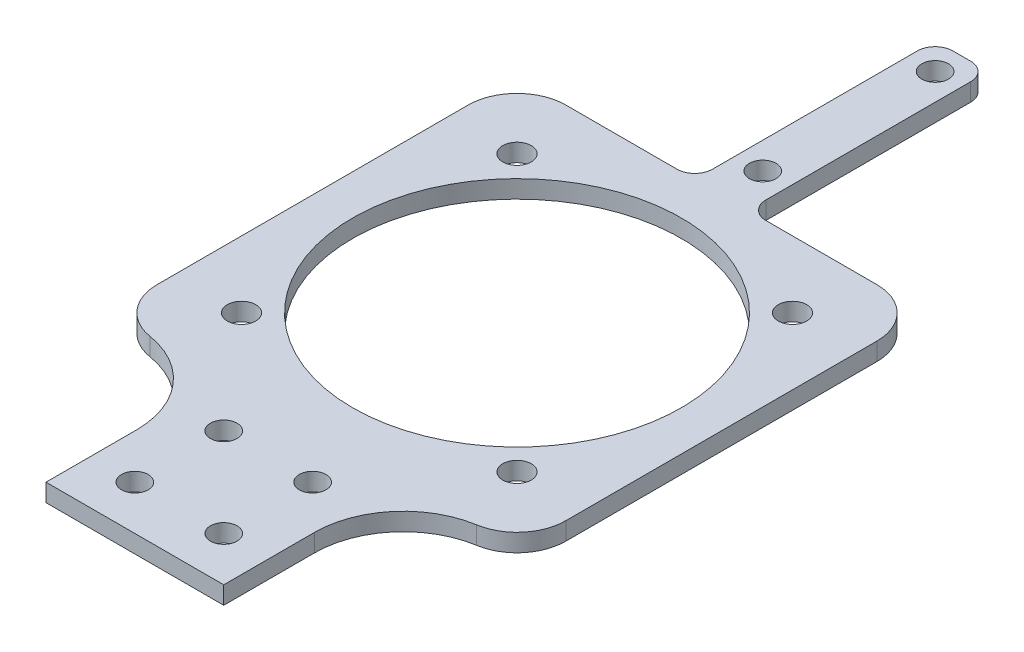
ISO-10303-21;
HEADER;
FILE_DESCRIPTION(('STEP AP214'),'2;1');
FILE_NAME('part.step','',(''),(''),'','','');
FILE_SCHEMA(('AUTOMOTIVE_DESIGN { 1 0 10303 214 1 1 1 1 }'));
ENDSEC;
DATA;
#1=APPLICATION_CONTEXT('core data for automotive mechanical design processes');
#2=APPLICATION_PROTOCOL_DEFINITION('international standard','automotive_design',2000,#1);
#3=PRODUCT_CONTEXT('',#1,'mechanical');
#4=PRODUCT('Part','Part','',(#3));
#5=PRODUCT_RELATED_PRODUCT_CATEGORY('part','',(#4));
#6=PRODUCT_DEFINITION_FORMATION('','',#4);
#7=PRODUCT_DEFINITION_CONTEXT('part definition',#1,'design');
#8=PRODUCT_DEFINITION('design','',#6,#7);
#9=PRODUCT_DEFINITION_SHAPE('','',#8);
#10=(LENGTH_UNIT() NAMED_UNIT(*) SI_UNIT(.MILLI.,.METRE.));
#11=(NAMED_UNIT(*) PLANE_ANGLE_UNIT() SI_UNIT($,.RADIAN.));
#12=(NAMED_UNIT(*) SI_UNIT($,.STERADIAN.) SOLID_ANGLE_UNIT());
#13=UNCERTAINTY_MEASURE_WITH_UNIT(LENGTH_MEASURE(1.E-05),#10,'distance_accuracy_value','');
#14=(GEOMETRIC_REPRESENTATION_CONTEXT(3) GLOBAL_UNCERTAINTY_ASSIGNED_CONTEXT((#13)) GLOBAL_UNIT_ASSIGNED_CONTEXT((#10,
#11,#12)) REPRESENTATION_CONTEXT('',''));
#15=CARTESIAN_POINT('',(0.,0.,0.));
#16=DIRECTION('',(0.,0.,1.));
#17=DIRECTION('',(1.,0.,0.));
#18=AXIS2_PLACEMENT_3D('',#15,#16,#17);
#19=CARTESIAN_POINT('',(-23.,2.,-23.));
#20=DIRECTION('',(0.,0.,1.));
#21=DIRECTION('',(1.,0.,0.));
#22=AXIS2_PLACEMENT_3D('',#19,#20,#21);
#23=PLANE('',#22);
#24=DIRECTION('',(-1.,0.,0.));
#25=VECTOR('',#24,1.);
#26=CARTESIAN_POINT('',(-23.,0.,-23.));
#27=LINE('',#26,#25);
#28=CARTESIAN_POINT('',(17.5,0.,-23.));
#29=VERTEX_POINT('',#28);
#30=CARTESIAN_POINT('',(5.,0.,-23.));
#31=VERTEX_POINT('',#30);
#32=EDGE_CURVE('E284',#29,#31,#27,.T.);
#33=ORIENTED_EDGE('',*,*,#32,.T.);
#34=DIRECTION('',(0.,1.,0.));
#35=VECTOR('',#34,1.);
#36=CARTESIAN_POINT('',(5.,2.,-23.));
#37=LINE('',#36,#35);
#38=CARTESIAN_POINT('',(5.,2.,-23.));
#39=VERTEX_POINT('',#38);
#40=EDGE_CURVE('E338',#31,#39,#37,.T.);
#41=ORIENTED_EDGE('',*,*,#40,.T.);
#42=DIRECTION('',(-1.,0.,0.));
#43=VECTOR('',#42,1.);
#44=CARTESIAN_POINT('',(-23.,2.,-23.));
#45=LINE('',#44,#43);
#46=CARTESIAN_POINT('',(17.5,2.,-23.));
#47=VERTEX_POINT('',#46);
#48=EDGE_CURVE('E271',#47,#39,#45,.T.);
#49=ORIENTED_EDGE('',*,*,#48,.F.);
#50=DIRECTION('',(0.,-1.,0.));
#51=VECTOR('',#50,1.);
#52=CARTESIAN_POINT('',(17.5,2.,-23.));
#53=LINE('',#52,#51);
#54=EDGE_CURVE('E327',#47,#29,#53,.T.);
#55=ORIENTED_EDGE('',*,*,#54,.T.);
#56=EDGE_LOOP('',(#33,#41,#49,#55));
#57=FACE_BOUND('',#56,.T.);
#58=ADVANCED_FACE('F47',(#57),#23,.F.);
#59=CARTESIAN_POINT('',(0.,2.,0.));
#60=DIRECTION('',(0.,-1.,0.));
#61=DIRECTION('',(0.,0.,-1.));
#62=AXIS2_PLACEMENT_3D('',#59,#60,#61);
#63=PLANE('',#62);
#64=CARTESIAN_POINT('',(15.5,2.,15.5));
#65=DIRECTION('',(0.,1.,0.));
#66=DIRECTION('',(0.,0.,1.));
#67=AXIS2_PLACEMENT_3D('',#64,#65,#66);
#68=CIRCLE('',#67,1.6);
#69=CARTESIAN_POINT('',(15.5,2.,17.1));
#70=VERTEX_POINT('',#69);
#71=EDGE_CURVE('E242',#70,#70,#68,.T.);
#72=ORIENTED_EDGE('',*,*,#71,.F.);
#73=EDGE_LOOP('',(#72));
#74=FACE_BOUND('',#73,.T.);
#75=CARTESIAN_POINT('',(15.5,2.,-15.5));
#76=DIRECTION('',(0.,1.,0.));
#77=DIRECTION('',(0.,0.,1.));
#78=AXIS2_PLACEMENT_3D('',#75,#76,#77);
#79=CIRCLE('',#78,1.6);
#80=CARTESIAN_POINT('',(15.5,2.,-13.9));
#81=VERTEX_POINT('',#80);
#82=EDGE_CURVE('E234',#81,#81,#79,.T.);
#83=ORIENTED_EDGE('',*,*,#82,.F.);
#84=EDGE_LOOP('',(#83));
#85=FACE_BOUND('',#84,.T.);
#86=CARTESIAN_POINT('',(-15.5,2.,-15.5));
#87=DIRECTION('',(0.,1.,0.));
#88=DIRECTION('',(0.,0.,1.));
#89=AXIS2_PLACEMENT_3D('',#86,#87,#88);
#90=CIRCLE('',#89,1.6);
#91=CARTESIAN_POINT('',(-15.5,2.,-13.9));
#92=VERTEX_POINT('',#91);
#93=EDGE_CURVE('E225',#92,#92,#90,.T.);
#94=ORIENTED_EDGE('',*,*,#93,.F.);
#95=EDGE_LOOP('',(#94));
#96=FACE_BOUND('',#95,.T.);
#97=CARTESIAN_POINT('',(-15.5,2.,15.5));
#98=DIRECTION('',(0.,1.,0.));
#99=DIRECTION('',(0.,0.,1.));
#100=AXIS2_PLACEMENT_3D('',#97,#98,#99);
#101=CIRCLE('',#100,1.6);
#102=CARTESIAN_POINT('',(-15.5,2.,17.1));
#103=VERTEX_POINT('',#102);
#104=EDGE_CURVE('E229',#103,#103,#101,.T.);
#105=ORIENTED_EDGE('',*,*,#104,.F.);
#106=EDGE_LOOP('',(#105));
#107=FACE_BOUND('',#106,.T.);
#108=DIRECTION('',(0.,0.,1.));
#109=VECTOR('',#108,1.);
#110=CARTESIAN_POINT('',(3.,2.,0.));
#111=LINE('',#110,#109);
#112=CARTESIAN_POINT('',(3.,2.,-48.0500130224788));
#113=VERTEX_POINT('',#112);
#114=CARTESIAN_POINT('',(3.,2.,-25.));
#115=VERTEX_POINT('',#114);
#116=EDGE_CURVE('E546',#113,#115,#111,.T.);
#117=ORIENTED_EDGE('',*,*,#116,.F.);
#118=CARTESIAN_POINT('',(0.999999999999997,2.,-48.0500130224788));
#119=DIRECTION('',(0.,-1.,0.));
#120=DIRECTION('',(0.,0.,-1.));
#121=AXIS2_PLACEMENT_3D('',#118,#119,#120);
#122=CIRCLE('',#121,2.);
#123=CARTESIAN_POINT('',(0.999999999999997,2.,-50.0500130224788));
#124=VERTEX_POINT('',#123);
#125=EDGE_CURVE('E362',#113,#124,#122,.F.);
#126=ORIENTED_EDGE('',*,*,#125,.T.);
#127=DIRECTION('',(1.,0.,0.));
#128=VECTOR('',#127,1.);
#129=CARTESIAN_POINT('',(0.,2.,-50.0500130224788));
#130=LINE('',#129,#128);
#131=CARTESIAN_POINT('',(-1.,2.,-50.0500130224788));
#132=VERTEX_POINT('',#131);
#133=EDGE_CURVE('E539',#132,#124,#130,.T.);
#134=ORIENTED_EDGE('',*,*,#133,.F.);
#135=CARTESIAN_POINT('',(-1.,2.,-48.0500130224788));
#136=DIRECTION('',(0.,-1.,0.));
#137=DIRECTION('',(0.,0.,-1.));
#138=AXIS2_PLACEMENT_3D('',#135,#136,#137);
#139=CIRCLE('',#138,2.);
#140=CARTESIAN_POINT('',(-3.,2.,-48.0500130224788));
#141=VERTEX_POINT('',#140);
#142=EDGE_CURVE('E359',#132,#141,#139,.F.);
#143=ORIENTED_EDGE('',*,*,#142,.T.);
#144=DIRECTION('',(0.,0.,1.));
#145=VECTOR('',#144,1.);
#146=CARTESIAN_POINT('',(-3.,2.,0.));
#147=LINE('',#146,#145);
#148=CARTESIAN_POINT('',(-3.,2.,-25.));
#149=VERTEX_POINT('',#148);
#150=EDGE_CURVE('E542',#141,#149,#147,.T.);
#151=ORIENTED_EDGE('',*,*,#150,.T.);
#152=CARTESIAN_POINT('',(-5.,2.,-25.));
#153=DIRECTION('',(0.,-1.,0.));
#154=DIRECTION('',(0.,0.,-1.));
#155=AXIS2_PLACEMENT_3D('',#152,#153,#154);
#156=CIRCLE('',#155,2.);
#157=CARTESIAN_POINT('',(-5.,2.,-23.));
#158=VERTEX_POINT('',#157);
#159=EDGE_CURVE('E384',#149,#158,#156,.T.);
#160=ORIENTED_EDGE('',*,*,#159,.T.);
#161=CARTESIAN_POINT('',(-17.5,2.,-23.));
#162=VERTEX_POINT('',#161);
#163=EDGE_CURVE('E269',#158,#162,#45,.T.);
#164=ORIENTED_EDGE('',*,*,#163,.T.);
#165=CARTESIAN_POINT('',(-17.5,2.,-17.5));
#166=DIRECTION('',(0.,-1.,0.));
#167=DIRECTION('',(0.,0.,-1.));
#168=AXIS2_PLACEMENT_3D('',#165,#166,#167);
#169=CIRCLE('',#168,5.5);
#170=CARTESIAN_POINT('',(-23.,2.,-17.5));
#171=VERTEX_POINT('',#170);
#172=EDGE_CURVE('E314',#162,#171,#169,.F.);
#173=ORIENTED_EDGE('',*,*,#172,.T.);
#174=DIRECTION('',(0.,0.,1.));
#175=VECTOR('',#174,1.);
#176=CARTESIAN_POINT('',(-23.,2.,23.));
#177=LINE('',#176,#175);
#178=CARTESIAN_POINT('',(-23.,2.,17.5));
#179=VERTEX_POINT('',#178);
#180=EDGE_CURVE('E275',#171,#179,#177,.T.);
#181=ORIENTED_EDGE('',*,*,#180,.T.);
#182=CARTESIAN_POINT('',(-17.5,2.,17.5));
#183=DIRECTION('',(0.,-1.,0.));
#184=DIRECTION('',(0.,0.,-1.));
#185=AXIS2_PLACEMENT_3D('',#182,#183,#184);
#186=CIRCLE('',#185,5.5);
#187=CARTESIAN_POINT('',(-18.3870967741936,2.,22.9279885144697));
#188=VERTEX_POINT('',#187);
#189=EDGE_CURVE('E311',#179,#188,#186,.F.);
#190=ORIENTED_EDGE('',*,*,#189,.T.);
#191=CARTESIAN_POINT('',(-20.,2.,32.7970585407784));
#192=DIRECTION('',(0.,-1.,0.));
#193=DIRECTION('',(0.,0.,-1.));
#194=AXIS2_PLACEMENT_3D('',#191,#192,#193);
#195=CIRCLE('',#194,10.);
#196=CARTESIAN_POINT('',(-10.,2.,32.7970585407784));
#197=VERTEX_POINT('',#196);
#198=EDGE_CURVE('E56',#188,#197,#195,.T.);
#199=ORIENTED_EDGE('',*,*,#198,.T.);
#200=DIRECTION('',(0.,0.,1.));
#201=VECTOR('',#200,1.);
#202=CARTESIAN_POINT('',(-10.,2.,23.));
#203=LINE('',#202,#201);
#204=CARTESIAN_POINT('',(-10.,2.,43.));
#205=VERTEX_POINT('',#204);
#206=EDGE_CURVE('E213',#197,#205,#203,.T.);
#207=ORIENTED_EDGE('',*,*,#206,.T.);
#208=DIRECTION('',(1.,0.,0.));
#209=VECTOR('',#208,1.);
#210=CARTESIAN_POINT('',(-10.,2.,43.));
#211=LINE('',#210,#209);
#212=CARTESIAN_POINT('',(10.,2.,43.));
#213=VERTEX_POINT('',#212);
#214=EDGE_CURVE('E198',#205,#213,#211,.T.);
#215=ORIENTED_EDGE('',*,*,#214,.T.);
#216=DIRECTION('',(0.,0.,-1.));
#217=VECTOR('',#216,1.);
#218=CARTESIAN_POINT('',(10.,2.,23.));
#219=LINE('',#218,#217);
#220=CARTESIAN_POINT('',(10.,2.,32.7970585407784));
#221=VERTEX_POINT('',#220);
#222=EDGE_CURVE('E191',#213,#221,#219,.T.);
#223=ORIENTED_EDGE('',*,*,#222,.T.);
#224=CARTESIAN_POINT('',(20.,2.,32.7970585407784));
#225=DIRECTION('',(0.,-1.,0.));
#226=DIRECTION('',(0.,0.,-1.));
#227=AXIS2_PLACEMENT_3D('',#224,#225,#226);
#228=CIRCLE('',#227,10.);
#229=CARTESIAN_POINT('',(18.3870967741935,2.,22.9279885144697));
#230=VERTEX_POINT('',#229);
#231=EDGE_CURVE('E403',#221,#230,#228,.T.);
#232=ORIENTED_EDGE('',*,*,#231,.T.);
#233=CARTESIAN_POINT('',(17.5,2.,17.5));
#234=DIRECTION('',(0.,-1.,0.));
#235=DIRECTION('',(0.,0.,-1.));
#236=AXIS2_PLACEMENT_3D('',#233,#234,#235);
#237=CIRCLE('',#236,5.5);
#238=CARTESIAN_POINT('',(23.,2.,17.5));
#239=VERTEX_POINT('',#238);
#240=EDGE_CURVE('E320',#230,#239,#237,.F.);
#241=ORIENTED_EDGE('',*,*,#240,.T.);
#242=DIRECTION('',(0.,0.,-1.));
#243=VECTOR('',#242,1.);
#244=CARTESIAN_POINT('',(23.,2.,23.));
#245=LINE('',#244,#243);
#246=CARTESIAN_POINT('',(23.,2.,-17.5));
#247=VERTEX_POINT('',#246);
#248=EDGE_CURVE('E265',#239,#247,#245,.T.);
#249=ORIENTED_EDGE('',*,*,#248,.T.);
#250=CARTESIAN_POINT('',(17.5,2.,-17.5));
#251=DIRECTION('',(0.,-1.,0.));
#252=DIRECTION('',(0.,0.,-1.));
#253=AXIS2_PLACEMENT_3D('',#250,#251,#252);
#254=CIRCLE('',#253,5.5);
#255=EDGE_CURVE('E317',#247,#47,#254,.F.);
#256=ORIENTED_EDGE('',*,*,#255,.T.);
#257=ORIENTED_EDGE('',*,*,#48,.T.);
#258=CARTESIAN_POINT('',(5.,2.,-25.));
#259=DIRECTION('',(0.,-1.,0.));
#260=DIRECTION('',(0.,0.,-1.));
#261=AXIS2_PLACEMENT_3D('',#258,#259,#260);
#262=CIRCLE('',#261,2.);
#263=EDGE_CURVE('E378',#39,#115,#262,.T.);
#264=ORIENTED_EDGE('',*,*,#263,.T.);
#265=EDGE_LOOP('',(#117,#126,#134,#143,#151,#160,#164,#173,#181,#190,#199,#207,#215,#223,#232,
#241,#249,#256,#257,#264));
#266=FACE_BOUND('',#265,.T.);
#267=CARTESIAN_POINT('',(0.,2.,0.));
#268=DIRECTION('',(0.,1.,0.));
#269=DIRECTION('',(0.,0.,1.));
#270=AXIS2_PLACEMENT_3D('',#267,#268,#269);
#271=CIRCLE('',#270,18.5);
#272=CARTESIAN_POINT('',(0.,2.,18.5));
#273=VERTEX_POINT('',#272);
#274=EDGE_CURVE('E257',#273,#273,#271,.T.);
#275=ORIENTED_EDGE('',*,*,#274,.F.);
#276=EDGE_LOOP('',(#275));
#277=FACE_BOUND('',#276,.T.);
#278=CARTESIAN_POINT('',(5.,2.,28.));
#279=DIRECTION('',(0.,1.,0.));
#280=DIRECTION('',(0.,0.,1.));
#281=AXIS2_PLACEMENT_3D('',#278,#279,#280);
#282=CIRCLE('',#281,1.5);
#283=CARTESIAN_POINT('',(5.,2.,29.5));
#284=VERTEX_POINT('',#283);
#285=EDGE_CURVE('E530',#284,#284,#282,.T.);
#286=ORIENTED_EDGE('',*,*,#285,.F.);
#287=EDGE_LOOP('',(#286));
#288=FACE_BOUND('',#287,.T.);
#289=CARTESIAN_POINT('',(-5.,2.,28.));
#290=DIRECTION('',(0.,1.,0.));
#291=DIRECTION('',(0.,0.,1.));
#292=AXIS2_PLACEMENT_3D('',#289,#290,#291);
#293=CIRCLE('',#292,1.5);
#294=CARTESIAN_POINT('',(-5.,2.,29.5));
#295=VERTEX_POINT('',#294);
#296=EDGE_CURVE('E554',#295,#295,#293,.T.);
#297=ORIENTED_EDGE('',*,*,#296,.F.);
#298=EDGE_LOOP('',(#297));
#299=FACE_BOUND('',#298,.T.);
#300=CARTESIAN_POINT('',(5.,2.,38.));
#301=DIRECTION('',(0.,1.,0.));
#302=DIRECTION('',(0.,0.,1.));
#303=AXIS2_PLACEMENT_3D('',#300,#301,#302);
#304=CIRCLE('',#303,1.5);
#305=CARTESIAN_POINT('',(5.,2.,39.5));
#306=VERTEX_POINT('',#305);
#307=EDGE_CURVE('E562',#306,#306,#304,.T.);
#308=ORIENTED_EDGE('',*,*,#307,.F.);
#309=EDGE_LOOP('',(#308));
#310=FACE_BOUND('',#309,.T.);
#311=CARTESIAN_POINT('',(-5.,2.,38.));
#312=DIRECTION('',(0.,1.,0.));
#313=DIRECTION('',(0.,0.,1.));
#314=AXIS2_PLACEMENT_3D('',#311,#312,#313);
#315=CIRCLE('',#314,1.5);
#316=CARTESIAN_POINT('',(-5.,2.,39.5));
#317=VERTEX_POINT('',#316);
#318=EDGE_CURVE('E570',#317,#317,#315,.T.);
#319=ORIENTED_EDGE('',*,*,#318,.F.);
#320=EDGE_LOOP('',(#319));
#321=FACE_BOUND('',#320,.T.);
#322=CARTESIAN_POINT('',(0.,2.,-27.6500130224788));
#323=DIRECTION('',(0.,1.,0.));
#324=DIRECTION('',(0.,0.,1.));
#325=AXIS2_PLACEMENT_3D('',#322,#323,#324);
#326=CIRCLE('',#325,1.5);
#327=CARTESIAN_POINT('',(0.,2.,-26.1500130224788));
#328=VERTEX_POINT('',#327);
#329=EDGE_CURVE('E531',#328,#328,#326,.T.);
#330=ORIENTED_EDGE('',*,*,#329,.F.);
#331=EDGE_LOOP('',(#330));
#332=FACE_BOUND('',#331,.T.);
#333=CARTESIAN_POINT('',(0.,2.,-47.0500130224788));
#334=DIRECTION('',(0.,1.,0.));
#335=DIRECTION('',(0.,0.,1.));
#336=AXIS2_PLACEMENT_3D('',#333,#334,#335);
#337=CIRCLE('',#336,1.5);
#338=CARTESIAN_POINT('',(0.,2.,-45.5500130224788));
#339=VERTEX_POINT('',#338);
#340=EDGE_CURVE('E535',#339,#339,#337,.T.);
#341=ORIENTED_EDGE('',*,*,#340,.F.);
#342=EDGE_LOOP('',(#341));
#343=FACE_BOUND('',#342,.T.);
#344=ADVANCED_FACE('F425',(#74,#85,#96,#107,#266,#277,#288,#299,#310,#321,#332,#343),#63,.F.);
#345=CARTESIAN_POINT('',(0.,0.,0.));
#346=DIRECTION('',(0.,-1.,0.));
#347=DIRECTION('',(0.,0.,-1.));
#348=AXIS2_PLACEMENT_3D('',#345,#346,#347);
#349=PLANE('',#348);
#350=CARTESIAN_POINT('',(15.5,0.,15.5));
#351=DIRECTION('',(0.,1.,0.));
#352=DIRECTION('',(0.,0.,1.));
#353=AXIS2_PLACEMENT_3D('',#350,#351,#352);
#354=CIRCLE('',#353,1.6);
#355=CARTESIAN_POINT('',(15.5,0.,17.1));
#356=VERTEX_POINT('',#355);
#357=EDGE_CURVE('E223',#356,#356,#354,.T.);
#358=ORIENTED_EDGE('',*,*,#357,.T.);
#359=EDGE_LOOP('',(#358));
#360=FACE_BOUND('',#359,.T.);
#361=CARTESIAN_POINT('',(15.5,0.,-15.5));
#362=DIRECTION('',(0.,1.,0.));
#363=DIRECTION('',(0.,0.,1.));
#364=AXIS2_PLACEMENT_3D('',#361,#362,#363);
#365=CIRCLE('',#364,1.6);
#366=CARTESIAN_POINT('',(15.5,0.,-13.9));
#367=VERTEX_POINT('',#366);
#368=EDGE_CURVE('E238',#367,#367,#365,.T.);
#369=ORIENTED_EDGE('',*,*,#368,.T.);
#370=EDGE_LOOP('',(#369));
#371=FACE_BOUND('',#370,.T.);
#372=CARTESIAN_POINT('',(-15.5,0.,-15.5));
#373=DIRECTION('',(0.,1.,0.));
#374=DIRECTION('',(0.,0.,1.));
#375=AXIS2_PLACEMENT_3D('',#372,#373,#374);
#376=CIRCLE('',#375,1.6);
#377=CARTESIAN_POINT('',(-15.5,0.,-13.9));
#378=VERTEX_POINT('',#377);
#379=EDGE_CURVE('E230',#378,#378,#376,.T.);
#380=ORIENTED_EDGE('',*,*,#379,.T.);
#381=EDGE_LOOP('',(#380));
#382=FACE_BOUND('',#381,.T.);
#383=CARTESIAN_POINT('',(-15.5,0.,15.5));
#384=DIRECTION('',(0.,1.,0.));
#385=DIRECTION('',(0.,0.,1.));
#386=AXIS2_PLACEMENT_3D('',#383,#384,#385);
#387=CIRCLE('',#386,1.6);
#388=CARTESIAN_POINT('',(-15.5,0.,17.1));
#389=VERTEX_POINT('',#388);
#390=EDGE_CURVE('E249',#389,#389,#387,.T.);
#391=ORIENTED_EDGE('',*,*,#390,.T.);
#392=EDGE_LOOP('',(#391));
#393=FACE_BOUND('',#392,.T.);
#394=DIRECTION('',(1.,0.,0.));
#395=VECTOR('',#394,1.);
#396=CARTESIAN_POINT('',(0.,0.,-50.0500130224788));
#397=LINE('',#396,#395);
#398=CARTESIAN_POINT('',(-1.,0.,-50.0500130224788));
#399=VERTEX_POINT('',#398);
#400=CARTESIAN_POINT('',(0.999999999999997,0.,-50.0500130224788));
#401=VERTEX_POINT('',#400);
#402=EDGE_CURVE('E506',#399,#401,#397,.T.);
#403=ORIENTED_EDGE('',*,*,#402,.T.);
#404=CARTESIAN_POINT('',(0.999999999999997,0.,-48.0500130224788));
#405=DIRECTION('',(0.,-1.,0.));
#406=DIRECTION('',(0.,0.,-1.));
#407=AXIS2_PLACEMENT_3D('',#404,#405,#406);
#408=CIRCLE('',#407,2.);
#409=CARTESIAN_POINT('',(3.,0.,-48.0500130224788));
#410=VERTEX_POINT('',#409);
#411=EDGE_CURVE('E375',#401,#410,#408,.T.);
#412=ORIENTED_EDGE('',*,*,#411,.T.);
#413=DIRECTION('',(0.,0.,1.));
#414=VECTOR('',#413,1.);
#415=CARTESIAN_POINT('',(3.,0.,0.));
#416=LINE('',#415,#414);
#417=CARTESIAN_POINT('',(3.,0.,-25.));
#418=VERTEX_POINT('',#417);
#419=EDGE_CURVE('E520',#410,#418,#416,.T.);
#420=ORIENTED_EDGE('',*,*,#419,.T.);
#421=CARTESIAN_POINT('',(5.,0.,-25.));
#422=DIRECTION('',(0.,-1.,0.));
#423=DIRECTION('',(0.,0.,-1.));
#424=AXIS2_PLACEMENT_3D('',#421,#422,#423);
#425=CIRCLE('',#424,2.);
#426=EDGE_CURVE('E381',#418,#31,#425,.F.);
#427=ORIENTED_EDGE('',*,*,#426,.T.);
#428=ORIENTED_EDGE('',*,*,#32,.F.);
#429=CARTESIAN_POINT('',(17.5,0.,-17.5));
#430=DIRECTION('',(0.,-1.,0.));
#431=DIRECTION('',(0.,0.,-1.));
#432=AXIS2_PLACEMENT_3D('',#429,#430,#431);
#433=CIRCLE('',#432,5.5);
#434=CARTESIAN_POINT('',(23.,0.,-17.5));
#435=VERTEX_POINT('',#434);
#436=EDGE_CURVE('E304',#29,#435,#433,.T.);
#437=ORIENTED_EDGE('',*,*,#436,.T.);
#438=DIRECTION('',(0.,0.,-1.));
#439=VECTOR('',#438,1.);
#440=CARTESIAN_POINT('',(23.,0.,23.));
#441=LINE('',#440,#439);
#442=CARTESIAN_POINT('',(23.,0.,17.5));
#443=VERTEX_POINT('',#442);
#444=EDGE_CURVE('E261',#443,#435,#441,.T.);
#445=ORIENTED_EDGE('',*,*,#444,.F.);
#446=CARTESIAN_POINT('',(17.5,0.,17.5));
#447=DIRECTION('',(0.,-1.,0.));
#448=DIRECTION('',(0.,0.,-1.));
#449=AXIS2_PLACEMENT_3D('',#446,#447,#448);
#450=CIRCLE('',#449,5.5);
#451=CARTESIAN_POINT('',(18.3870967741935,0.,22.9279885144697));
#452=VERTEX_POINT('',#451);
#453=EDGE_CURVE('E307',#443,#452,#450,.T.);
#454=ORIENTED_EDGE('',*,*,#453,.T.);
#455=CARTESIAN_POINT('',(20.,0.,32.7970585407784));
#456=DIRECTION('',(0.,-1.,0.));
#457=DIRECTION('',(0.,0.,-1.));
#458=AXIS2_PLACEMENT_3D('',#455,#456,#457);
#459=CIRCLE('',#458,10.);
#460=CARTESIAN_POINT('',(10.,0.,32.7970585407784));
#461=VERTEX_POINT('',#460);
#462=EDGE_CURVE('E406',#452,#461,#459,.F.);
#463=ORIENTED_EDGE('',*,*,#462,.T.);
#464=DIRECTION('',(0.,0.,-1.));
#465=VECTOR('',#464,1.);
#466=CARTESIAN_POINT('',(10.,0.,23.));
#467=LINE('',#466,#465);
#468=CARTESIAN_POINT('',(10.,0.,43.));
#469=VERTEX_POINT('',#468);
#470=EDGE_CURVE('E201',#469,#461,#467,.T.);
#471=ORIENTED_EDGE('',*,*,#470,.F.);
#472=DIRECTION('',(1.,0.,0.));
#473=VECTOR('',#472,1.);
#474=CARTESIAN_POINT('',(-10.,0.,43.));
#475=LINE('',#474,#473);
#476=CARTESIAN_POINT('',(-10.,0.,43.));
#477=VERTEX_POINT('',#476);
#478=EDGE_CURVE('E190',#477,#469,#475,.T.);
#479=ORIENTED_EDGE('',*,*,#478,.F.);
#480=DIRECTION('',(0.,0.,1.));
#481=VECTOR('',#480,1.);
#482=CARTESIAN_POINT('',(-10.,0.,23.));
#483=LINE('',#482,#481);
#484=CARTESIAN_POINT('',(-10.,0.,32.7970585407784));
#485=VERTEX_POINT('',#484);
#486=EDGE_CURVE('E181',#485,#477,#483,.T.);
#487=ORIENTED_EDGE('',*,*,#486,.F.);
#488=CARTESIAN_POINT('',(-20.,0.,32.7970585407784));
#489=DIRECTION('',(0.,-1.,0.));
#490=DIRECTION('',(0.,0.,-1.));
#491=AXIS2_PLACEMENT_3D('',#488,#489,#490);
#492=CIRCLE('',#491,10.);
#493=CARTESIAN_POINT('',(-18.3870967741936,0.,22.9279885144697));
#494=VERTEX_POINT('',#493);
#495=EDGE_CURVE('E11',#485,#494,#492,.F.);
#496=ORIENTED_EDGE('',*,*,#495,.T.);
#497=CARTESIAN_POINT('',(-17.5,0.,17.5));
#498=DIRECTION('',(0.,-1.,0.));
#499=DIRECTION('',(0.,0.,-1.));
#500=AXIS2_PLACEMENT_3D('',#497,#498,#499);
#501=CIRCLE('',#500,5.5);
#502=CARTESIAN_POINT('',(-23.,0.,17.5));
#503=VERTEX_POINT('',#502);
#504=EDGE_CURVE('E297',#494,#503,#501,.T.);
#505=ORIENTED_EDGE('',*,*,#504,.T.);
#506=DIRECTION('',(0.,0.,1.));
#507=VECTOR('',#506,1.);
#508=CARTESIAN_POINT('',(-23.,0.,23.));
#509=LINE('',#508,#507);
#510=CARTESIAN_POINT('',(-23.,0.,-17.5));
#511=VERTEX_POINT('',#510);
#512=EDGE_CURVE('E270',#511,#503,#509,.T.);
#513=ORIENTED_EDGE('',*,*,#512,.F.);
#514=CARTESIAN_POINT('',(-17.5,0.,-17.5));
#515=DIRECTION('',(0.,-1.,0.));
#516=DIRECTION('',(0.,0.,-1.));
#517=AXIS2_PLACEMENT_3D('',#514,#515,#516);
#518=CIRCLE('',#517,5.5);
#519=CARTESIAN_POINT('',(-17.5,0.,-23.));
#520=VERTEX_POINT('',#519);
#521=EDGE_CURVE('E300',#511,#520,#518,.T.);
#522=ORIENTED_EDGE('',*,*,#521,.T.);
#523=CARTESIAN_POINT('',(-5.,0.,-23.));
#524=VERTEX_POINT('',#523);
#525=EDGE_CURVE('E283',#524,#520,#27,.T.);
#526=ORIENTED_EDGE('',*,*,#525,.F.);
#527=CARTESIAN_POINT('',(-5.,0.,-25.));
#528=DIRECTION('',(0.,-1.,0.));
#529=DIRECTION('',(0.,0.,-1.));
#530=AXIS2_PLACEMENT_3D('',#527,#528,#529);
#531=CIRCLE('',#530,2.);
#532=CARTESIAN_POINT('',(-3.,0.,-25.));
#533=VERTEX_POINT('',#532);
#534=EDGE_CURVE('E387',#524,#533,#531,.F.);
#535=ORIENTED_EDGE('',*,*,#534,.T.);
#536=DIRECTION('',(0.,0.,1.));
#537=VECTOR('',#536,1.);
#538=CARTESIAN_POINT('',(-3.,0.,0.));
#539=LINE('',#538,#537);
#540=CARTESIAN_POINT('',(-3.,0.,-48.0500130224788));
#541=VERTEX_POINT('',#540);
#542=EDGE_CURVE('E509',#541,#533,#539,.T.);
#543=ORIENTED_EDGE('',*,*,#542,.F.);
#544=CARTESIAN_POINT('',(-1.,0.,-48.0500130224788));
#545=DIRECTION('',(0.,-1.,0.));
#546=DIRECTION('',(0.,0.,-1.));
#547=AXIS2_PLACEMENT_3D('',#544,#545,#546);
#548=CIRCLE('',#547,2.);
#549=EDGE_CURVE('E372',#541,#399,#548,.T.);
#550=ORIENTED_EDGE('',*,*,#549,.T.);
#551=EDGE_LOOP('',(#403,#412,#420,#427,#428,#437,#445,#454,#463,#471,#479,#487,#496,#505,#513,
#522,#526,#535,#543,#550));
#552=FACE_BOUND('',#551,.T.);
#553=CARTESIAN_POINT('',(0.,0.,0.));
#554=DIRECTION('',(0.,1.,0.));
#555=DIRECTION('',(0.,0.,1.));
#556=AXIS2_PLACEMENT_3D('',#553,#554,#555);
#557=CIRCLE('',#556,18.5);
#558=CARTESIAN_POINT('',(0.,0.,18.5));
#559=VERTEX_POINT('',#558);
#560=EDGE_CURVE('E253',#559,#559,#557,.T.);
#561=ORIENTED_EDGE('',*,*,#560,.T.);
#562=EDGE_LOOP('',(#561));
#563=FACE_BOUND('',#562,.T.);
#564=CARTESIAN_POINT('',(5.,0.,28.));
#565=DIRECTION('',(0.,1.,0.));
#566=DIRECTION('',(0.,0.,1.));
#567=AXIS2_PLACEMENT_3D('',#564,#565,#566);
#568=CIRCLE('',#567,1.5);
#569=CARTESIAN_POINT('',(5.,0.,29.5));
#570=VERTEX_POINT('',#569);
#571=EDGE_CURVE('E550',#570,#570,#568,.T.);
#572=ORIENTED_EDGE('',*,*,#571,.T.);
#573=EDGE_LOOP('',(#572));
#574=FACE_BOUND('',#573,.T.);
#575=CARTESIAN_POINT('',(-5.,0.,28.));
#576=DIRECTION('',(0.,1.,0.));
#577=DIRECTION('',(0.,0.,1.));
#578=AXIS2_PLACEMENT_3D('',#575,#576,#577);
#579=CIRCLE('',#578,1.5);
#580=CARTESIAN_POINT('',(-5.,0.,29.5));
#581=VERTEX_POINT('',#580);
#582=EDGE_CURVE('E558',#581,#581,#579,.T.);
#583=ORIENTED_EDGE('',*,*,#582,.T.);
#584=EDGE_LOOP('',(#583));
#585=FACE_BOUND('',#584,.T.);
#586=CARTESIAN_POINT('',(5.,0.,38.));
#587=DIRECTION('',(0.,1.,0.));
#588=DIRECTION('',(0.,0.,1.));
#589=AXIS2_PLACEMENT_3D('',#586,#587,#588);
#590=CIRCLE('',#589,1.5);
#591=CARTESIAN_POINT('',(5.,0.,39.5));
#592=VERTEX_POINT('',#591);
#593=EDGE_CURVE('E566',#592,#592,#590,.T.);
#594=ORIENTED_EDGE('',*,*,#593,.T.);
#595=EDGE_LOOP('',(#594));
#596=FACE_BOUND('',#595,.T.);
#597=CARTESIAN_POINT('',(-5.,0.,38.));
#598=DIRECTION('',(0.,1.,0.));
#599=DIRECTION('',(0.,0.,1.));
#600=AXIS2_PLACEMENT_3D('',#597,#598,#599);
#601=CIRCLE('',#600,1.5);
#602=CARTESIAN_POINT('',(-5.,0.,39.5));
#603=VERTEX_POINT('',#602);
#604=EDGE_CURVE('E216',#603,#603,#601,.T.);
#605=ORIENTED_EDGE('',*,*,#604,.T.);
#606=EDGE_LOOP('',(#605));
#607=FACE_BOUND('',#606,.T.);
#608=CARTESIAN_POINT('',(0.,0.,-27.6500130224788));
#609=DIRECTION('',(0.,1.,0.));
#610=DIRECTION('',(0.,0.,1.));
#611=AXIS2_PLACEMENT_3D('',#608,#609,#610);
#612=CIRCLE('',#611,1.5);
#613=CARTESIAN_POINT('',(0.,0.,-26.1500130224788));
#614=VERTEX_POINT('',#613);
#615=EDGE_CURVE('E523',#614,#614,#612,.T.);
#616=ORIENTED_EDGE('',*,*,#615,.T.);
#617=EDGE_LOOP('',(#616));
#618=FACE_BOUND('',#617,.T.);
#619=CARTESIAN_POINT('',(0.,0.,-47.0500130224788));
#620=DIRECTION('',(0.,1.,0.));
#621=DIRECTION('',(0.,0.,1.));
#622=AXIS2_PLACEMENT_3D('',#619,#620,#621);
#623=CIRCLE('',#622,1.5);
#624=CARTESIAN_POINT('',(0.,0.,-45.5500130224788));
#625=VERTEX_POINT('',#624);
#626=EDGE_CURVE('E516',#625,#625,#623,.T.);
#627=ORIENTED_EDGE('',*,*,#626,.T.);
#628=EDGE_LOOP('',(#627));
#629=FACE_BOUND('',#628,.T.);
#630=ADVANCED_FACE('F204',(#360,#371,#382,#393,#552,#563,#574,#585,#596,#607,#618,#629),#349,.T.);
#631=CARTESIAN_POINT('',(23.,2.,23.));
#632=DIRECTION('',(-1.,0.,0.));
#633=DIRECTION('',(0.,0.,1.));
#634=AXIS2_PLACEMENT_3D('',#631,#632,#633);
#635=PLANE('',#634);
#636=ORIENTED_EDGE('',*,*,#248,.F.);
#637=DIRECTION('',(0.,-1.,0.));
#638=VECTOR('',#637,1.);
#639=CARTESIAN_POINT('',(23.,2.,17.5));
#640=LINE('',#639,#638);
#641=EDGE_CURVE('E293',#239,#443,#640,.T.);
#642=ORIENTED_EDGE('',*,*,#641,.T.);
#643=ORIENTED_EDGE('',*,*,#444,.T.);
#644=DIRECTION('',(0.,-1.,0.));
#645=VECTOR('',#644,1.);
#646=CARTESIAN_POINT('',(23.,2.,-17.5));
#647=LINE('',#646,#645);
#648=EDGE_CURVE('E279',#435,#247,#647,.F.);
#649=ORIENTED_EDGE('',*,*,#648,.T.);
#650=EDGE_LOOP('',(#636,#642,#643,#649));
#651=FACE_BOUND('',#650,.T.);
#652=ADVANCED_FACE('F455',(#651),#635,.F.);
#653=ORIENTED_EDGE('',*,*,#163,.F.);
#654=DIRECTION('',(0.,1.,0.));
#655=VECTOR('',#654,1.);
#656=CARTESIAN_POINT('',(-5.,2.,-23.));
#657=LINE('',#656,#655);
#658=EDGE_CURVE('E356',#158,#524,#657,.F.);
#659=ORIENTED_EDGE('',*,*,#658,.T.);
#660=ORIENTED_EDGE('',*,*,#525,.T.);
#661=DIRECTION('',(0.,-1.,0.));
#662=VECTOR('',#661,1.);
#663=CARTESIAN_POINT('',(-17.5,2.,-23.));
#664=LINE('',#663,#662);
#665=EDGE_CURVE('E323',#520,#162,#664,.F.);
#666=ORIENTED_EDGE('',*,*,#665,.T.);
#667=EDGE_LOOP('',(#653,#659,#660,#666));
#668=FACE_BOUND('',#667,.T.);
#669=ADVANCED_FACE('F414',(#668),#23,.F.);
#670=CARTESIAN_POINT('',(-23.,2.,23.));
#671=DIRECTION('',(1.,0.,0.));
#672=DIRECTION('',(0.,0.,-1.));
#673=AXIS2_PLACEMENT_3D('',#670,#671,#672);
#674=PLANE('',#673);
#675=ORIENTED_EDGE('',*,*,#180,.F.);
#676=DIRECTION('',(0.,-1.,0.));
#677=VECTOR('',#676,1.);
#678=CARTESIAN_POINT('',(-23.,2.,-17.5));
#679=LINE('',#678,#677);
#680=EDGE_CURVE('E334',#171,#511,#679,.T.);
#681=ORIENTED_EDGE('',*,*,#680,.T.);
#682=ORIENTED_EDGE('',*,*,#512,.T.);
#683=DIRECTION('',(0.,-1.,0.));
#684=VECTOR('',#683,1.);
#685=CARTESIAN_POINT('',(-23.,2.,17.5));
#686=LINE('',#685,#684);
#687=EDGE_CURVE('E331',#503,#179,#686,.F.);
#688=ORIENTED_EDGE('',*,*,#687,.T.);
#689=EDGE_LOOP('',(#675,#681,#682,#688));
#690=FACE_BOUND('',#689,.T.);
#691=ADVANCED_FACE('F429',(#690),#674,.F.);
#692=CARTESIAN_POINT('',(0.,2.,0.));
#693=DIRECTION('',(0.,-1.,0.));
#694=DIRECTION('',(0.,0.,-1.));
#695=AXIS2_PLACEMENT_3D('',#692,#693,#694);
#696=CYLINDRICAL_SURFACE('',#695,18.5);
#697=ORIENTED_EDGE('',*,*,#274,.T.);
#698=EDGE_LOOP('',(#697));
#699=FACE_BOUND('',#698,.T.);
#700=ORIENTED_EDGE('',*,*,#560,.F.);
#701=EDGE_LOOP('',(#700));
#702=FACE_BOUND('',#701,.T.);
#703=ADVANCED_FACE('F460',(#699,#702),#696,.F.);
#704=CARTESIAN_POINT('',(17.5,2.,17.5));
#705=DIRECTION('',(0.,-1.,0.));
#706=DIRECTION('',(0.,0.,-1.));
#707=AXIS2_PLACEMENT_3D('',#704,#705,#706);
#708=CYLINDRICAL_SURFACE('',#707,5.5);
#709=ORIENTED_EDGE('',*,*,#240,.F.);
#710=DIRECTION('',(0.,-1.,0.));
#711=VECTOR('',#710,1.);
#712=CARTESIAN_POINT('',(18.3870967741935,2.,22.9279885144697));
#713=LINE('',#712,#711);
#714=EDGE_CURVE('E394',#230,#452,#713,.T.);
#715=ORIENTED_EDGE('',*,*,#714,.T.);
#716=ORIENTED_EDGE('',*,*,#453,.F.);
#717=ORIENTED_EDGE('',*,*,#641,.F.);
#718=EDGE_LOOP('',(#709,#715,#716,#717));
#719=FACE_BOUND('',#718,.T.);
#720=ADVANCED_FACE('F471',(#719),#708,.T.);
#721=CARTESIAN_POINT('',(17.5,2.,-17.5));
#722=DIRECTION('',(0.,-1.,0.));
#723=DIRECTION('',(0.,0.,-1.));
#724=AXIS2_PLACEMENT_3D('',#721,#722,#723);
#725=CYLINDRICAL_SURFACE('',#724,5.5);
#726=ORIENTED_EDGE('',*,*,#255,.F.);
#727=ORIENTED_EDGE('',*,*,#648,.F.);
#728=ORIENTED_EDGE('',*,*,#436,.F.);
#729=ORIENTED_EDGE('',*,*,#54,.F.);
#730=EDGE_LOOP('',(#726,#727,#728,#729));
#731=FACE_BOUND('',#730,.T.);
#732=ADVANCED_FACE('F474',(#731),#725,.T.);
#733=CARTESIAN_POINT('',(-17.5,2.,-17.5));
#734=DIRECTION('',(0.,-1.,0.));
#735=DIRECTION('',(0.,0.,-1.));
#736=AXIS2_PLACEMENT_3D('',#733,#734,#735);
#737=CYLINDRICAL_SURFACE('',#736,5.5);
#738=ORIENTED_EDGE('',*,*,#172,.F.);
#739=ORIENTED_EDGE('',*,*,#665,.F.);
#740=ORIENTED_EDGE('',*,*,#521,.F.);
#741=ORIENTED_EDGE('',*,*,#680,.F.);
#742=EDGE_LOOP('',(#738,#739,#740,#741));
#743=FACE_BOUND('',#742,.T.);
#744=ADVANCED_FACE('F422',(#743),#737,.T.);
#745=CARTESIAN_POINT('',(-17.5,2.,17.5));
#746=DIRECTION('',(0.,-1.,0.));
#747=DIRECTION('',(0.,0.,-1.));
#748=AXIS2_PLACEMENT_3D('',#745,#746,#747);
#749=CYLINDRICAL_SURFACE('',#748,5.5);
#750=ORIENTED_EDGE('',*,*,#504,.F.);
#751=DIRECTION('',(0.,-1.,0.));
#752=VECTOR('',#751,1.);
#753=CARTESIAN_POINT('',(-18.3870967741936,2.,22.9279885144697));
#754=LINE('',#753,#752);
#755=EDGE_CURVE('E397',#494,#188,#754,.F.);
#756=ORIENTED_EDGE('',*,*,#755,.T.);
#757=ORIENTED_EDGE('',*,*,#189,.F.);
#758=ORIENTED_EDGE('',*,*,#687,.F.);
#759=EDGE_LOOP('',(#750,#756,#757,#758));
#760=FACE_BOUND('',#759,.T.);
#761=ADVANCED_FACE('F433',(#760),#749,.T.);
#762=CARTESIAN_POINT('',(-15.5,0.,15.5));
#763=DIRECTION('',(0.,1.,0.));
#764=DIRECTION('',(0.,0.,1.));
#765=AXIS2_PLACEMENT_3D('',#762,#763,#764);
#766=CYLINDRICAL_SURFACE('',#765,1.6);
#767=ORIENTED_EDGE('',*,*,#390,.F.);
#768=EDGE_LOOP('',(#767));
#769=FACE_BOUND('',#768,.T.);
#770=ORIENTED_EDGE('',*,*,#104,.T.);
#771=EDGE_LOOP('',(#770));
#772=FACE_BOUND('',#771,.T.);
#773=ADVANCED_FACE('F483',(#769,#772),#766,.F.);
#774=CARTESIAN_POINT('',(-15.5,0.,-15.5));
#775=DIRECTION('',(0.,1.,0.));
#776=DIRECTION('',(0.,0.,1.));
#777=AXIS2_PLACEMENT_3D('',#774,#775,#776);
#778=CYLINDRICAL_SURFACE('',#777,1.6);
#779=ORIENTED_EDGE('',*,*,#379,.F.);
#780=EDGE_LOOP('',(#779));
#781=FACE_BOUND('',#780,.T.);
#782=ORIENTED_EDGE('',*,*,#93,.T.);
#783=EDGE_LOOP('',(#782));
#784=FACE_BOUND('',#783,.T.);
#785=ADVANCED_FACE('F628',(#781,#784),#778,.F.);
#786=CARTESIAN_POINT('',(15.5,0.,-15.5));
#787=DIRECTION('',(0.,1.,0.));
#788=DIRECTION('',(0.,0.,1.));
#789=AXIS2_PLACEMENT_3D('',#786,#787,#788);
#790=CYLINDRICAL_SURFACE('',#789,1.6);
#791=ORIENTED_EDGE('',*,*,#368,.F.);
#792=EDGE_LOOP('',(#791));
#793=FACE_BOUND('',#792,.T.);
#794=ORIENTED_EDGE('',*,*,#82,.T.);
#795=EDGE_LOOP('',(#794));
#796=FACE_BOUND('',#795,.T.);
#797=ADVANCED_FACE('F631',(#793,#796),#790,.F.);
#798=CARTESIAN_POINT('',(15.5,0.,15.5));
#799=DIRECTION('',(0.,1.,0.));
#800=DIRECTION('',(0.,0.,1.));
#801=AXIS2_PLACEMENT_3D('',#798,#799,#800);
#802=CYLINDRICAL_SURFACE('',#801,1.6);
#803=ORIENTED_EDGE('',*,*,#357,.F.);
#804=EDGE_LOOP('',(#803));
#805=FACE_BOUND('',#804,.T.);
#806=ORIENTED_EDGE('',*,*,#71,.T.);
#807=EDGE_LOOP('',(#806));
#808=FACE_BOUND('',#807,.T.);
#809=ADVANCED_FACE('F622',(#805,#808),#802,.F.);
#810=CARTESIAN_POINT('',(10.,0.,23.));
#811=DIRECTION('',(1.,0.,0.));
#812=DIRECTION('',(0.,0.,-1.));
#813=AXIS2_PLACEMENT_3D('',#810,#811,#812);
#814=PLANE('',#813);
#815=ORIENTED_EDGE('',*,*,#470,.T.);
#816=DIRECTION('',(0.,1.,0.));
#817=VECTOR('',#816,1.);
#818=CARTESIAN_POINT('',(10.,2.,32.7970585407784));
#819=LINE('',#818,#817);
#820=EDGE_CURVE('E390',#461,#221,#819,.T.);
#821=ORIENTED_EDGE('',*,*,#820,.T.);
#822=ORIENTED_EDGE('',*,*,#222,.F.);
#823=DIRECTION('',(0.,1.,0.));
#824=VECTOR('',#823,1.);
#825=CARTESIAN_POINT('',(10.,0.,43.));
#826=LINE('',#825,#824);
#827=EDGE_CURVE('E200',#469,#213,#826,.T.);
#828=ORIENTED_EDGE('',*,*,#827,.F.);
#829=EDGE_LOOP('',(#815,#821,#822,#828));
#830=FACE_BOUND('',#829,.T.);
#831=ADVANCED_FACE('F619',(#830),#814,.T.);
#832=CARTESIAN_POINT('',(-10.,0.,43.));
#833=DIRECTION('',(0.,0.,1.));
#834=DIRECTION('',(1.,0.,0.));
#835=AXIS2_PLACEMENT_3D('',#832,#833,#834);
#836=PLANE('',#835);
#837=ORIENTED_EDGE('',*,*,#214,.F.);
#838=DIRECTION('',(0.,1.,0.));
#839=VECTOR('',#838,1.);
#840=CARTESIAN_POINT('',(-10.,0.,43.));
#841=LINE('',#840,#839);
#842=EDGE_CURVE('E184',#477,#205,#841,.T.);
#843=ORIENTED_EDGE('',*,*,#842,.F.);
#844=ORIENTED_EDGE('',*,*,#478,.T.);
#845=ORIENTED_EDGE('',*,*,#827,.T.);
#846=EDGE_LOOP('',(#837,#843,#844,#845));
#847=FACE_BOUND('',#846,.T.);
#848=ADVANCED_FACE('F195',(#847),#836,.T.);
#849=CARTESIAN_POINT('',(-10.,0.,23.));
#850=DIRECTION('',(-1.,0.,0.));
#851=DIRECTION('',(0.,0.,1.));
#852=AXIS2_PLACEMENT_3D('',#849,#850,#851);
#853=PLANE('',#852);
#854=ORIENTED_EDGE('',*,*,#206,.F.);
#855=DIRECTION('',(0.,1.,0.));
#856=VECTOR('',#855,1.);
#857=CARTESIAN_POINT('',(-10.,0.,32.7970585407784));
#858=LINE('',#857,#856);
#859=EDGE_CURVE('E63',#197,#485,#858,.F.);
#860=ORIENTED_EDGE('',*,*,#859,.T.);
#861=ORIENTED_EDGE('',*,*,#486,.T.);
#862=ORIENTED_EDGE('',*,*,#842,.T.);
#863=EDGE_LOOP('',(#854,#860,#861,#862));
#864=FACE_BOUND('',#863,.T.);
#865=ADVANCED_FACE('F183',(#864),#853,.T.);
#866=CARTESIAN_POINT('',(-5.,0.,38.));
#867=DIRECTION('',(0.,1.,0.));
#868=DIRECTION('',(0.,0.,1.));
#869=AXIS2_PLACEMENT_3D('',#866,#867,#868);
#870=CYLINDRICAL_SURFACE('',#869,1.5);
#871=ORIENTED_EDGE('',*,*,#604,.F.);
#872=EDGE_LOOP('',(#871));
#873=FACE_BOUND('',#872,.T.);
#874=ORIENTED_EDGE('',*,*,#318,.T.);
#875=EDGE_LOOP('',(#874));
#876=FACE_BOUND('',#875,.T.);
#877=ADVANCED_FACE('F580',(#873,#876),#870,.F.);
#878=CARTESIAN_POINT('',(5.,0.,38.));
#879=DIRECTION('',(0.,1.,0.));
#880=DIRECTION('',(0.,0.,1.));
#881=AXIS2_PLACEMENT_3D('',#878,#879,#880);
#882=CYLINDRICAL_SURFACE('',#881,1.5);
#883=ORIENTED_EDGE('',*,*,#593,.F.);
#884=EDGE_LOOP('',(#883));
#885=FACE_BOUND('',#884,.T.);
#886=ORIENTED_EDGE('',*,*,#307,.T.);
#887=EDGE_LOOP('',(#886));
#888=FACE_BOUND('',#887,.T.);
#889=ADVANCED_FACE('F611',(#885,#888),#882,.F.);
#890=CARTESIAN_POINT('',(-5.,0.,28.));
#891=DIRECTION('',(0.,1.,0.));
#892=DIRECTION('',(0.,0.,1.));
#893=AXIS2_PLACEMENT_3D('',#890,#891,#892);
#894=CYLINDRICAL_SURFACE('',#893,1.5);
#895=ORIENTED_EDGE('',*,*,#582,.F.);
#896=EDGE_LOOP('',(#895));
#897=FACE_BOUND('',#896,.T.);
#898=ORIENTED_EDGE('',*,*,#296,.T.);
#899=EDGE_LOOP('',(#898));
#900=FACE_BOUND('',#899,.T.);
#901=ADVANCED_FACE('F607',(#897,#900),#894,.F.);
#902=CARTESIAN_POINT('',(5.,0.,28.));
#903=DIRECTION('',(0.,1.,0.));
#904=DIRECTION('',(0.,0.,1.));
#905=AXIS2_PLACEMENT_3D('',#902,#903,#904);
#906=CYLINDRICAL_SURFACE('',#905,1.5);
#907=ORIENTED_EDGE('',*,*,#571,.F.);
#908=EDGE_LOOP('',(#907));
#909=FACE_BOUND('',#908,.T.);
#910=ORIENTED_EDGE('',*,*,#285,.T.);
#911=EDGE_LOOP('',(#910));
#912=FACE_BOUND('',#911,.T.);
#913=ADVANCED_FACE('F605',(#909,#912),#906,.F.);
#914=CARTESIAN_POINT('',(0.,0.,-50.0500130224788));
#915=DIRECTION('',(0.,0.,1.));
#916=DIRECTION('',(1.,0.,0.));
#917=AXIS2_PLACEMENT_3D('',#914,#915,#916);
#918=PLANE('',#917);
#919=ORIENTED_EDGE('',*,*,#133,.T.);
#920=DIRECTION('',(0.,1.,0.));
#921=VECTOR('',#920,1.);
#922=CARTESIAN_POINT('',(0.999999999999997,0.,-50.0500130224788));
#923=LINE('',#922,#921);
#924=EDGE_CURVE('E369',#124,#401,#923,.F.);
#925=ORIENTED_EDGE('',*,*,#924,.T.);
#926=ORIENTED_EDGE('',*,*,#402,.F.);
#927=DIRECTION('',(0.,1.,0.));
#928=VECTOR('',#927,1.);
#929=CARTESIAN_POINT('',(-1.,2.,-50.0500130224788));
#930=LINE('',#929,#928);
#931=EDGE_CURVE('E365',#399,#132,#930,.T.);
#932=ORIENTED_EDGE('',*,*,#931,.T.);
#933=EDGE_LOOP('',(#919,#925,#926,#932));
#934=FACE_BOUND('',#933,.T.);
#935=ADVANCED_FACE('F512',(#934),#918,.F.);
#936=CARTESIAN_POINT('',(3.,0.,0.));
#937=DIRECTION('',(-1.,0.,0.));
#938=DIRECTION('',(0.,0.,1.));
#939=AXIS2_PLACEMENT_3D('',#936,#937,#938);
#940=PLANE('',#939);
#941=ORIENTED_EDGE('',*,*,#116,.T.);
#942=DIRECTION('',(0.,1.,0.));
#943=VECTOR('',#942,1.);
#944=CARTESIAN_POINT('',(3.,0.,-25.));
#945=LINE('',#944,#943);
#946=EDGE_CURVE('E346',#115,#418,#945,.F.);
#947=ORIENTED_EDGE('',*,*,#946,.T.);
#948=ORIENTED_EDGE('',*,*,#419,.F.);
#949=DIRECTION('',(0.,1.,0.));
#950=VECTOR('',#949,1.);
#951=CARTESIAN_POINT('',(3.,0.,-48.0500130224788));
#952=LINE('',#951,#950);
#953=EDGE_CURVE('E342',#410,#113,#952,.T.);
#954=ORIENTED_EDGE('',*,*,#953,.T.);
#955=EDGE_LOOP('',(#941,#947,#948,#954));
#956=FACE_BOUND('',#955,.T.);
#957=ADVANCED_FACE('F590',(#956),#940,.F.);
#958=CARTESIAN_POINT('',(0.,0.,-47.0500130224788));
#959=DIRECTION('',(0.,1.,0.));
#960=DIRECTION('',(0.,0.,1.));
#961=AXIS2_PLACEMENT_3D('',#958,#959,#960);
#962=CYLINDRICAL_SURFACE('',#961,1.5);
#963=ORIENTED_EDGE('',*,*,#626,.F.);
#964=EDGE_LOOP('',(#963));
#965=FACE_BOUND('',#964,.T.);
#966=ORIENTED_EDGE('',*,*,#340,.T.);
#967=EDGE_LOOP('',(#966));
#968=FACE_BOUND('',#967,.T.);
#969=ADVANCED_FACE('F587',(#965,#968),#962,.F.);
#970=CARTESIAN_POINT('',(0.,0.,-27.6500130224788));
#971=DIRECTION('',(0.,1.,0.));
#972=DIRECTION('',(0.,0.,1.));
#973=AXIS2_PLACEMENT_3D('',#970,#971,#972);
#974=CYLINDRICAL_SURFACE('',#973,1.5);
#975=ORIENTED_EDGE('',*,*,#615,.F.);
#976=EDGE_LOOP('',(#975));
#977=FACE_BOUND('',#976,.T.);
#978=ORIENTED_EDGE('',*,*,#329,.T.);
#979=EDGE_LOOP('',(#978));
#980=FACE_BOUND('',#979,.T.);
#981=ADVANCED_FACE('F589',(#977,#980),#974,.F.);
#982=CARTESIAN_POINT('',(-3.,0.,0.));
#983=DIRECTION('',(-1.,0.,0.));
#984=DIRECTION('',(0.,0.,1.));
#985=AXIS2_PLACEMENT_3D('',#982,#983,#984);
#986=PLANE('',#985);
#987=ORIENTED_EDGE('',*,*,#542,.T.);
#988=DIRECTION('',(0.,1.,0.));
#989=VECTOR('',#988,1.);
#990=CARTESIAN_POINT('',(-3.,0.,-25.));
#991=LINE('',#990,#989);
#992=EDGE_CURVE('E352',#533,#149,#991,.T.);
#993=ORIENTED_EDGE('',*,*,#992,.T.);
#994=ORIENTED_EDGE('',*,*,#150,.F.);
#995=DIRECTION('',(0.,1.,0.));
#996=VECTOR('',#995,1.);
#997=CARTESIAN_POINT('',(-3.,0.,-48.0500130224788));
#998=LINE('',#997,#996);
#999=EDGE_CURVE('E349',#141,#541,#998,.F.);
#1000=ORIENTED_EDGE('',*,*,#999,.T.);
#1001=EDGE_LOOP('',(#987,#993,#994,#1000));
#1002=FACE_BOUND('',#1001,.T.);
#1003=ADVANCED_FACE('F488',(#1002),#986,.T.);
#1004=CARTESIAN_POINT('',(5.,2.,-25.));
#1005=DIRECTION('',(0.,-1.,0.));
#1006=DIRECTION('',(0.,0.,-1.));
#1007=AXIS2_PLACEMENT_3D('',#1004,#1005,#1006);
#1008=CYLINDRICAL_SURFACE('',#1007,2.);
#1009=ORIENTED_EDGE('',*,*,#426,.F.);
#1010=ORIENTED_EDGE('',*,*,#946,.F.);
#1011=ORIENTED_EDGE('',*,*,#263,.F.);
#1012=ORIENTED_EDGE('',*,*,#40,.F.);
#1013=EDGE_LOOP('',(#1009,#1010,#1011,#1012));
#1014=FACE_BOUND('',#1013,.T.);
#1015=ADVANCED_FACE('F484',(#1014),#1008,.F.);
#1016=CARTESIAN_POINT('',(-5.,0.,-25.));
#1017=DIRECTION('',(0.,1.,0.));
#1018=DIRECTION('',(0.,0.,1.));
#1019=AXIS2_PLACEMENT_3D('',#1016,#1017,#1018);
#1020=CYLINDRICAL_SURFACE('',#1019,2.);
#1021=ORIENTED_EDGE('',*,*,#534,.F.);
#1022=ORIENTED_EDGE('',*,*,#658,.F.);
#1023=ORIENTED_EDGE('',*,*,#159,.F.);
#1024=ORIENTED_EDGE('',*,*,#992,.F.);
#1025=EDGE_LOOP('',(#1021,#1022,#1023,#1024));
#1026=FACE_BOUND('',#1025,.T.);
#1027=ADVANCED_FACE('F487',(#1026),#1020,.F.);
#1028=CARTESIAN_POINT('',(0.999999999999997,0.,-48.0500130224788));
#1029=DIRECTION('',(0.,1.,0.));
#1030=DIRECTION('',(0.,0.,1.));
#1031=AXIS2_PLACEMENT_3D('',#1028,#1029,#1030);
#1032=CYLINDRICAL_SURFACE('',#1031,2.);
#1033=ORIENTED_EDGE('',*,*,#411,.F.);
#1034=ORIENTED_EDGE('',*,*,#924,.F.);
#1035=ORIENTED_EDGE('',*,*,#125,.F.);
#1036=ORIENTED_EDGE('',*,*,#953,.F.);
#1037=EDGE_LOOP('',(#1033,#1034,#1035,#1036));
#1038=FACE_BOUND('',#1037,.T.);
#1039=ADVANCED_FACE('F492',(#1038),#1032,.T.);
#1040=CARTESIAN_POINT('',(-1.,0.,-48.0500130224788));
#1041=DIRECTION('',(0.,-1.,0.));
#1042=DIRECTION('',(0.,0.,-1.));
#1043=AXIS2_PLACEMENT_3D('',#1040,#1041,#1042);
#1044=CYLINDRICAL_SURFACE('',#1043,2.);
#1045=ORIENTED_EDGE('',*,*,#549,.F.);
#1046=ORIENTED_EDGE('',*,*,#999,.F.);
#1047=ORIENTED_EDGE('',*,*,#142,.F.);
#1048=ORIENTED_EDGE('',*,*,#931,.F.);
#1049=EDGE_LOOP('',(#1045,#1046,#1047,#1048));
#1050=FACE_BOUND('',#1049,.T.);
#1051=ADVANCED_FACE('F441',(#1050),#1044,.T.);
#1052=CARTESIAN_POINT('',(20.,2.,32.7970585407784));
#1053=DIRECTION('',(0.,-1.,0.));
#1054=DIRECTION('',(0.,0.,-1.));
#1055=AXIS2_PLACEMENT_3D('',#1052,#1053,#1054);
#1056=CYLINDRICAL_SURFACE('',#1055,10.);
#1057=ORIENTED_EDGE('',*,*,#462,.F.);
#1058=ORIENTED_EDGE('',*,*,#714,.F.);
#1059=ORIENTED_EDGE('',*,*,#231,.F.);
#1060=ORIENTED_EDGE('',*,*,#820,.F.);
#1061=EDGE_LOOP('',(#1057,#1058,#1059,#1060));
#1062=FACE_BOUND('',#1061,.T.);
#1063=ADVANCED_FACE('F437',(#1062),#1056,.F.);
#1064=CARTESIAN_POINT('',(-20.,2.,32.7970585407784));
#1065=DIRECTION('',(0.,-1.,0.));
#1066=DIRECTION('',(0.,0.,-1.));
#1067=AXIS2_PLACEMENT_3D('',#1064,#1065,#1066);
#1068=CYLINDRICAL_SURFACE('',#1067,10.);
#1069=ORIENTED_EDGE('',*,*,#495,.F.);
#1070=ORIENTED_EDGE('',*,*,#859,.F.);
#1071=ORIENTED_EDGE('',*,*,#198,.F.);
#1072=ORIENTED_EDGE('',*,*,#755,.F.);
#1073=EDGE_LOOP('',(#1069,#1070,#1071,#1072));
#1074=FACE_BOUND('',#1073,.T.);
#1075=ADVANCED_FACE('F49',(#1074),#1068,.F.);
#1076=CLOSED_SHELL('',(#58,#344,#630,#652,#669,#691,#703,#720,#732,#744,#761,#773,#785,#797,
#809,#831,#848,#865,#877,#889,#901,#913,#935,#957,#969,#981,#1003,#1015,#1027,#1039,#1051,#1063,#1075));
#1077=MANIFOLD_SOLID_BREP('B2',#1076);
#1078=ADVANCED_BREP_SHAPE_REPRESENTATION('',(#18,#1077),#14);
#1079=SHAPE_DEFINITION_REPRESENTATION(#9,#1078);
ENDSEC;
END-ISO-10303-21;
